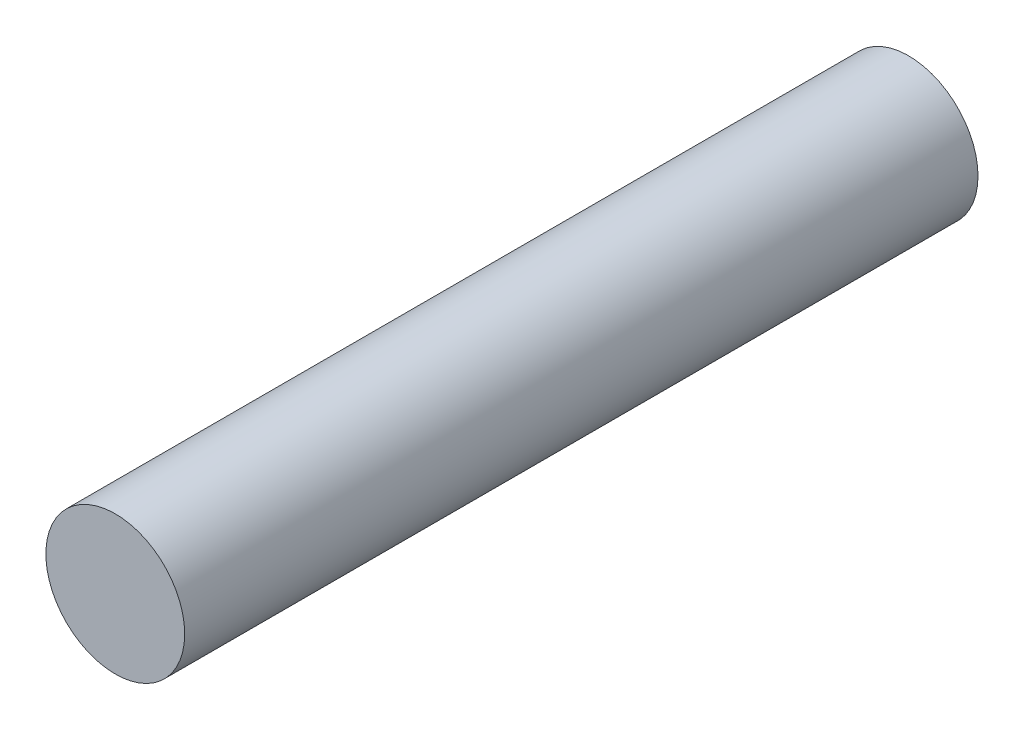
ISO-10303-21;
HEADER;
FILE_DESCRIPTION(('STEP AP214'),'2;1');
FILE_NAME('part.step','',(''),(''),'','','');
FILE_SCHEMA(('AUTOMOTIVE_DESIGN { 1 0 10303 214 1 1 1 1 }'));
ENDSEC;
DATA;
#1=APPLICATION_CONTEXT('core data for automotive mechanical design processes');
#2=APPLICATION_PROTOCOL_DEFINITION('international standard','automotive_design',2000,#1);
#3=PRODUCT_CONTEXT('',#1,'mechanical');
#4=PRODUCT('Part','Part','',(#3));
#5=PRODUCT_RELATED_PRODUCT_CATEGORY('part','',(#4));
#6=PRODUCT_DEFINITION_FORMATION('','',#4);
#7=PRODUCT_DEFINITION_CONTEXT('part definition',#1,'design');
#8=PRODUCT_DEFINITION('design','',#6,#7);
#9=PRODUCT_DEFINITION_SHAPE('','',#8);
#10=(LENGTH_UNIT() NAMED_UNIT(*) SI_UNIT(.MILLI.,.METRE.));
#11=(NAMED_UNIT(*) PLANE_ANGLE_UNIT() SI_UNIT($,.RADIAN.));
#12=(NAMED_UNIT(*) SI_UNIT($,.STERADIAN.) SOLID_ANGLE_UNIT());
#13=UNCERTAINTY_MEASURE_WITH_UNIT(LENGTH_MEASURE(1.E-05),#10,'distance_accuracy_value','');
#14=(GEOMETRIC_REPRESENTATION_CONTEXT(3) GLOBAL_UNCERTAINTY_ASSIGNED_CONTEXT((#13)) GLOBAL_UNIT_ASSIGNED_CONTEXT((#10,
#11,#12)) REPRESENTATION_CONTEXT('',''));
#15=CARTESIAN_POINT('',(0.,0.,0.));
#16=DIRECTION('',(0.,0.,1.));
#17=DIRECTION('',(1.,0.,0.));
#18=AXIS2_PLACEMENT_3D('',#15,#16,#17);
#19=CARTESIAN_POINT('',(0.,0.,20.));
#20=DIRECTION('',(0.,0.,-1.));
#21=DIRECTION('',(-1.,0.,0.));
#22=AXIS2_PLACEMENT_3D('',#19,#20,#21);
#23=CYLINDRICAL_SURFACE('',#22,1.75);
#24=CARTESIAN_POINT('',(0.,0.,20.));
#25=DIRECTION('',(0.,0.,1.));
#26=DIRECTION('',(1.,0.,0.));
#27=AXIS2_PLACEMENT_3D('',#24,#25,#26);
#28=CIRCLE('',#27,1.75);
#29=CARTESIAN_POINT('',(1.75,0.,20.));
#30=VERTEX_POINT('',#29);
#31=EDGE_CURVE('E10',#30,#30,#28,.T.);
#32=ORIENTED_EDGE('',*,*,#31,.F.);
#33=EDGE_LOOP('',(#32));
#34=FACE_BOUND('',#33,.T.);
#35=CARTESIAN_POINT('',(0.,0.,0.));
#36=DIRECTION('',(0.,0.,1.));
#37=DIRECTION('',(1.,0.,0.));
#38=AXIS2_PLACEMENT_3D('',#35,#36,#37);
#39=CIRCLE('',#38,1.75);
#40=CARTESIAN_POINT('',(1.75,0.,0.));
#41=VERTEX_POINT('',#40);
#42=EDGE_CURVE('E44',#41,#41,#39,.T.);
#43=ORIENTED_EDGE('',*,*,#42,.T.);
#44=EDGE_LOOP('',(#43));
#45=FACE_BOUND('',#44,.T.);
#46=ADVANCED_FACE('F41',(#34,#45),#23,.T.);
#47=CARTESIAN_POINT('',(0.,0.,20.));
#48=DIRECTION('',(0.,0.,1.));
#49=DIRECTION('',(1.,0.,0.));
#50=AXIS2_PLACEMENT_3D('',#47,#48,#49);
#51=PLANE('',#50);
#52=ORIENTED_EDGE('',*,*,#31,.T.);
#53=EDGE_LOOP('',(#52));
#54=FACE_BOUND('',#53,.T.);
#55=ADVANCED_FACE('F58',(#54),#51,.T.);
#56=CARTESIAN_POINT('',(0.,0.,0.));
#57=DIRECTION('',(0.,0.,1.));
#58=DIRECTION('',(1.,0.,0.));
#59=AXIS2_PLACEMENT_3D('',#56,#57,#58);
#60=PLANE('',#59);
#61=ORIENTED_EDGE('',*,*,#42,.F.);
#62=EDGE_LOOP('',(#61));
#63=FACE_BOUND('',#62,.T.);
#64=ADVANCED_FACE('F56',(#63),#60,.F.);
#65=CLOSED_SHELL('',(#46,#55,#64));
#66=MANIFOLD_SOLID_BREP('B2',#65);
#67=ADVANCED_BREP_SHAPE_REPRESENTATION('',(#18,#66),#14);
#68=SHAPE_DEFINITION_REPRESENTATION(#9,#67);
ENDSEC;
END-ISO-10303-21;
